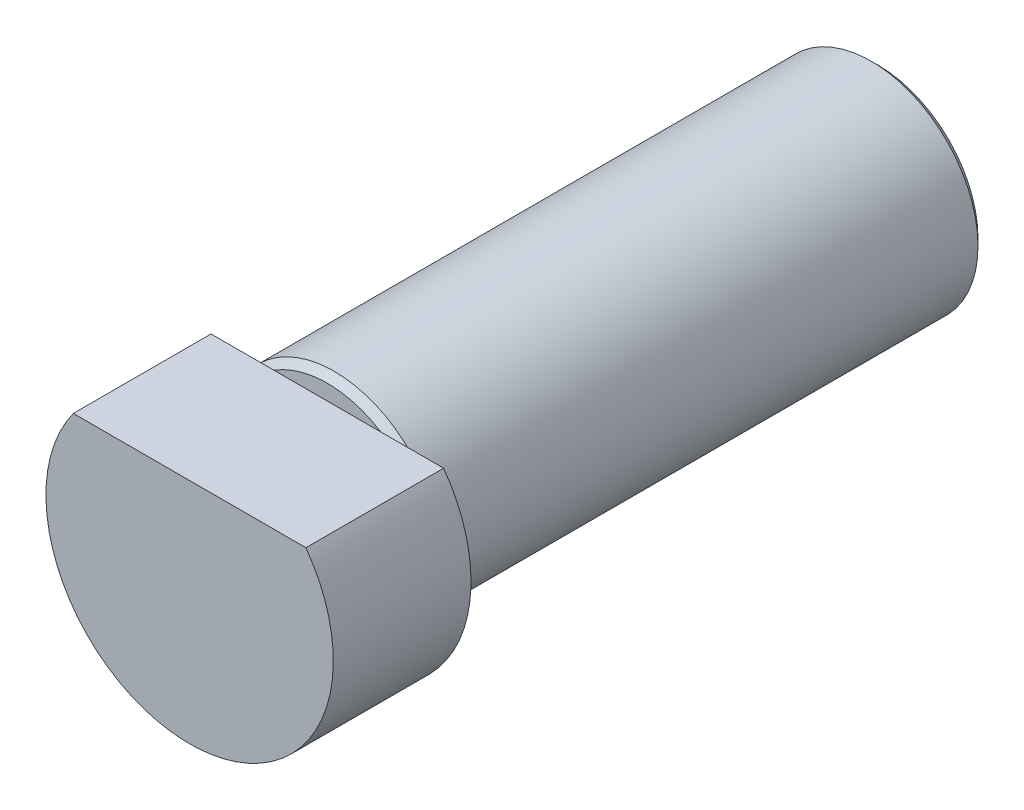
ISO-10303-21;
HEADER;
FILE_DESCRIPTION(('STEP AP214'),'2;1');
FILE_NAME('part.step','',(''),(''),'','','');
FILE_SCHEMA(('AUTOMOTIVE_DESIGN { 1 0 10303 214 1 1 1 1 }'));
ENDSEC;
DATA;
#1=APPLICATION_CONTEXT('core data for automotive mechanical design processes');
#2=APPLICATION_PROTOCOL_DEFINITION('international standard','automotive_design',2000,#1);
#3=PRODUCT_CONTEXT('',#1,'mechanical');
#4=PRODUCT('Part','Part','',(#3));
#5=PRODUCT_RELATED_PRODUCT_CATEGORY('part','',(#4));
#6=PRODUCT_DEFINITION_FORMATION('','',#4);
#7=PRODUCT_DEFINITION_CONTEXT('part definition',#1,'design');
#8=PRODUCT_DEFINITION('design','',#6,#7);
#9=PRODUCT_DEFINITION_SHAPE('','',#8);
#10=(LENGTH_UNIT() NAMED_UNIT(*) SI_UNIT(.MILLI.,.METRE.));
#11=(NAMED_UNIT(*) PLANE_ANGLE_UNIT() SI_UNIT($,.RADIAN.));
#12=(NAMED_UNIT(*) SI_UNIT($,.STERADIAN.) SOLID_ANGLE_UNIT());
#13=UNCERTAINTY_MEASURE_WITH_UNIT(LENGTH_MEASURE(1.E-05),#10,'distance_accuracy_value','');
#14=(GEOMETRIC_REPRESENTATION_CONTEXT(3) GLOBAL_UNCERTAINTY_ASSIGNED_CONTEXT((#13)) GLOBAL_UNIT_ASSIGNED_CONTEXT((#10,
#11,#12)) REPRESENTATION_CONTEXT('',''));
#15=CARTESIAN_POINT('',(0.,0.,0.));
#16=DIRECTION('',(0.,0.,1.));
#17=DIRECTION('',(1.,0.,0.));
#18=AXIS2_PLACEMENT_3D('',#15,#16,#17);
#19=CARTESIAN_POINT('',(0.,0.,4.));
#20=DIRECTION('',(0.,0.,-1.));
#21=DIRECTION('',(-1.,0.,0.));
#22=AXIS2_PLACEMENT_3D('',#19,#20,#21);
#23=CYLINDRICAL_SURFACE('',#22,0.775);
#24=CARTESIAN_POINT('',(0.,0.,3.95));
#25=DIRECTION('',(0.,0.,1.));
#26=DIRECTION('',(1.,0.,0.));
#27=AXIS2_PLACEMENT_3D('',#24,#25,#26);
#28=CIRCLE('',#27,0.775);
#29=CARTESIAN_POINT('',(0.775,0.,3.95));
#30=VERTEX_POINT('',#29);
#31=EDGE_CURVE('E117',#30,#30,#28,.F.);
#32=ORIENTED_EDGE('',*,*,#31,.T.);
#33=EDGE_LOOP('',(#32));
#34=FACE_BOUND('',#33,.T.);
#35=CARTESIAN_POINT('',(0.,0.,0.0499999999999997));
#36=DIRECTION('',(0.,0.,1.));
#37=DIRECTION('',(1.,0.,0.));
#38=AXIS2_PLACEMENT_3D('',#35,#36,#37);
#39=CIRCLE('',#38,0.775);
#40=CARTESIAN_POINT('',(0.775,0.,0.0499999999999997));
#41=VERTEX_POINT('',#40);
#42=EDGE_CURVE('E114',#41,#41,#39,.T.);
#43=ORIENTED_EDGE('',*,*,#42,.T.);
#44=EDGE_LOOP('',(#43));
#45=FACE_BOUND('',#44,.T.);
#46=ADVANCED_FACE('F47',(#34,#45),#23,.T.);
#47=CARTESIAN_POINT('',(0.,0.,4.));
#48=DIRECTION('',(0.,0.,1.));
#49=DIRECTION('',(1.,0.,0.));
#50=AXIS2_PLACEMENT_3D('',#47,#48,#49);
#51=PLANE('',#50);
#52=DIRECTION('',(-1.,0.,0.));
#53=VECTOR('',#52,1.);
#54=CARTESIAN_POINT('',(-0.844567845185667,0.612649901427603,4.));
#55=LINE('',#54,#53);
#56=CARTESIAN_POINT('',(0.38766622019561,0.612649901427603,4.));
#57=VERTEX_POINT('',#56);
#58=CARTESIAN_POINT('',(-0.38766622019561,0.612649901427603,4.));
#59=VERTEX_POINT('',#58);
#60=EDGE_CURVE('E11',#57,#59,#55,.T.);
#61=ORIENTED_EDGE('',*,*,#60,.F.);
#62=CARTESIAN_POINT('',(0.,0.,4.));
#63=DIRECTION('',(0.,0.,1.));
#64=DIRECTION('',(1.,0.,0.));
#65=AXIS2_PLACEMENT_3D('',#62,#63,#64);
#66=CIRCLE('',#65,0.725000000000002);
#67=EDGE_CURVE('E67',#57,#59,#66,.T.);
#68=ORIENTED_EDGE('',*,*,#67,.T.);
#69=EDGE_LOOP('',(#61,#68));
#70=FACE_BOUND('',#69,.T.);
#71=ADVANCED_FACE('F135',(#70),#51,.T.);
#72=CARTESIAN_POINT('',(0.,0.,0.));
#73=DIRECTION('',(0.,0.,1.));
#74=DIRECTION('',(1.,0.,0.));
#75=AXIS2_PLACEMENT_3D('',#72,#73,#74);
#76=PLANE('',#75);
#77=CARTESIAN_POINT('',(0.,0.,0.));
#78=DIRECTION('',(0.,0.,1.));
#79=DIRECTION('',(1.,0.,0.));
#80=AXIS2_PLACEMENT_3D('',#77,#78,#79);
#81=CIRCLE('',#80,0.725);
#82=CARTESIAN_POINT('',(0.725,0.,0.));
#83=VERTEX_POINT('',#82);
#84=EDGE_CURVE('E52',#83,#83,#81,.F.);
#85=ORIENTED_EDGE('',*,*,#84,.T.);
#86=EDGE_LOOP('',(#85));
#87=FACE_BOUND('',#86,.T.);
#88=ADVANCED_FACE('F126',(#87),#76,.F.);
#89=CARTESIAN_POINT('',(0.,0.,4.));
#90=DIRECTION('',(0.,0.,-1.));
#91=DIRECTION('',(-1.,0.,0.));
#92=AXIS2_PLACEMENT_3D('',#89,#90,#91);
#93=CONICAL_SURFACE('',#92,0.725000000000002,0.785398163397444);
#94=ORIENTED_EDGE('',*,*,#31,.F.);
#95=EDGE_LOOP('',(#94));
#96=FACE_BOUND('',#95,.T.);
#97=ORIENTED_EDGE('',*,*,#67,.F.);
#98=EDGE_CURVE('E105',#59,#57,#66,.T.);
#99=ORIENTED_EDGE('',*,*,#98,.F.);
#100=EDGE_LOOP('',(#97,#99));
#101=FACE_BOUND('',#100,.T.);
#102=ADVANCED_FACE('F131',(#96,#101),#93,.T.);
#103=CARTESIAN_POINT('',(0.,0.,0.0499999999999997));
#104=DIRECTION('',(0.,0.,1.));
#105=DIRECTION('',(1.,0.,0.));
#106=AXIS2_PLACEMENT_3D('',#103,#104,#105);
#107=CONICAL_SURFACE('',#106,0.775,0.785398163397454);
#108=ORIENTED_EDGE('',*,*,#84,.F.);
#109=EDGE_LOOP('',(#108));
#110=FACE_BOUND('',#109,.T.);
#111=ORIENTED_EDGE('',*,*,#42,.F.);
#112=EDGE_LOOP('',(#111));
#113=FACE_BOUND('',#112,.T.);
#114=ADVANCED_FACE('F50',(#110,#113),#107,.T.);
#115=CARTESIAN_POINT('',(0.,0.,4.));
#116=DIRECTION('',(0.,0.,1.));
#117=DIRECTION('',(1.,0.,0.));
#118=AXIS2_PLACEMENT_3D('',#115,#116,#117);
#119=PLANE('',#118);
#120=CARTESIAN_POINT('',(-0.844567845185667,0.612649901427603,4.));
#121=VERTEX_POINT('',#120);
#122=EDGE_CURVE('E60',#59,#121,#55,.T.);
#123=ORIENTED_EDGE('',*,*,#122,.F.);
#124=ORIENTED_EDGE('',*,*,#98,.T.);
#125=CARTESIAN_POINT('',(0.844567845185667,0.612649901427603,4.));
#126=VERTEX_POINT('',#125);
#127=EDGE_CURVE('E59',#126,#57,#55,.T.);
#128=ORIENTED_EDGE('',*,*,#127,.F.);
#129=CARTESIAN_POINT('',(0.,0.,4.));
#130=DIRECTION('',(0.,0.,1.));
#131=DIRECTION('',(1.,0.,0.));
#132=AXIS2_PLACEMENT_3D('',#129,#130,#131);
#133=CIRCLE('',#132,1.04337660834466);
#134=EDGE_CURVE('E103',#121,#126,#133,.T.);
#135=ORIENTED_EDGE('',*,*,#134,.F.);
#136=EDGE_LOOP('',(#123,#124,#128,#135));
#137=FACE_BOUND('',#136,.T.);
#138=ADVANCED_FACE('F130',(#137),#119,.F.);
#139=CARTESIAN_POINT('',(0.,0.,5.));
#140=DIRECTION('',(0.,0.,-1.));
#141=DIRECTION('',(-1.,0.,0.));
#142=AXIS2_PLACEMENT_3D('',#139,#140,#141);
#143=CYLINDRICAL_SURFACE('',#142,1.04337660834466);
#144=ORIENTED_EDGE('',*,*,#134,.T.);
#145=DIRECTION('',(0.,0.,-1.));
#146=VECTOR('',#145,1.);
#147=CARTESIAN_POINT('',(0.844567845185667,0.612649901427603,5.));
#148=LINE('',#147,#146);
#149=CARTESIAN_POINT('',(0.844567845185667,0.612649901427603,5.));
#150=VERTEX_POINT('',#149);
#151=EDGE_CURVE('E88',#150,#126,#148,.T.);
#152=ORIENTED_EDGE('',*,*,#151,.F.);
#153=CARTESIAN_POINT('',(0.,0.,5.));
#154=DIRECTION('',(0.,0.,1.));
#155=DIRECTION('',(1.,0.,0.));
#156=AXIS2_PLACEMENT_3D('',#153,#154,#155);
#157=CIRCLE('',#156,1.04337660834466);
#158=CARTESIAN_POINT('',(-0.844567845185667,0.612649901427603,5.));
#159=VERTEX_POINT('',#158);
#160=EDGE_CURVE('E95',#159,#150,#157,.T.);
#161=ORIENTED_EDGE('',*,*,#160,.F.);
#162=DIRECTION('',(0.,0.,-1.));
#163=VECTOR('',#162,1.);
#164=CARTESIAN_POINT('',(-0.844567845185667,0.612649901427603,5.));
#165=LINE('',#164,#163);
#166=EDGE_CURVE('E91',#159,#121,#165,.T.);
#167=ORIENTED_EDGE('',*,*,#166,.T.);
#168=EDGE_LOOP('',(#144,#152,#161,#167));
#169=FACE_BOUND('',#168,.T.);
#170=ADVANCED_FACE('F101',(#169),#143,.T.);
#171=CARTESIAN_POINT('',(-0.844567845185667,0.612649901427603,5.));
#172=DIRECTION('',(0.,-1.,0.));
#173=DIRECTION('',(0.,0.,-1.));
#174=AXIS2_PLACEMENT_3D('',#171,#172,#173);
#175=PLANE('',#174);
#176=ORIENTED_EDGE('',*,*,#127,.T.);
#177=ORIENTED_EDGE('',*,*,#60,.T.);
#178=ORIENTED_EDGE('',*,*,#122,.T.);
#179=ORIENTED_EDGE('',*,*,#166,.F.);
#180=DIRECTION('',(-1.,0.,0.));
#181=VECTOR('',#180,1.);
#182=CARTESIAN_POINT('',(-0.844567845185667,0.612649901427603,5.));
#183=LINE('',#182,#181);
#184=EDGE_CURVE('E83',#150,#159,#183,.T.);
#185=ORIENTED_EDGE('',*,*,#184,.F.);
#186=ORIENTED_EDGE('',*,*,#151,.T.);
#187=EDGE_LOOP('',(#176,#177,#178,#179,#185,#186));
#188=FACE_BOUND('',#187,.T.);
#189=ADVANCED_FACE('F86',(#188),#175,.F.);
#190=CARTESIAN_POINT('',(0.,0.,5.));
#191=DIRECTION('',(0.,0.,1.));
#192=DIRECTION('',(1.,0.,0.));
#193=AXIS2_PLACEMENT_3D('',#190,#191,#192);
#194=PLANE('',#193);
#195=ORIENTED_EDGE('',*,*,#160,.T.);
#196=ORIENTED_EDGE('',*,*,#184,.T.);
#197=EDGE_LOOP('',(#195,#196));
#198=FACE_BOUND('',#197,.T.);
#199=ADVANCED_FACE('F97',(#198),#194,.T.);
#200=CLOSED_SHELL('',(#46,#71,#88,#102,#114,#138,#170,#189,#199));
#201=MANIFOLD_SOLID_BREP('B2',#200);
#202=ADVANCED_BREP_SHAPE_REPRESENTATION('',(#18,#201),#14);
#203=SHAPE_DEFINITION_REPRESENTATION(#9,#202);
ENDSEC;
END-ISO-10303-21;
